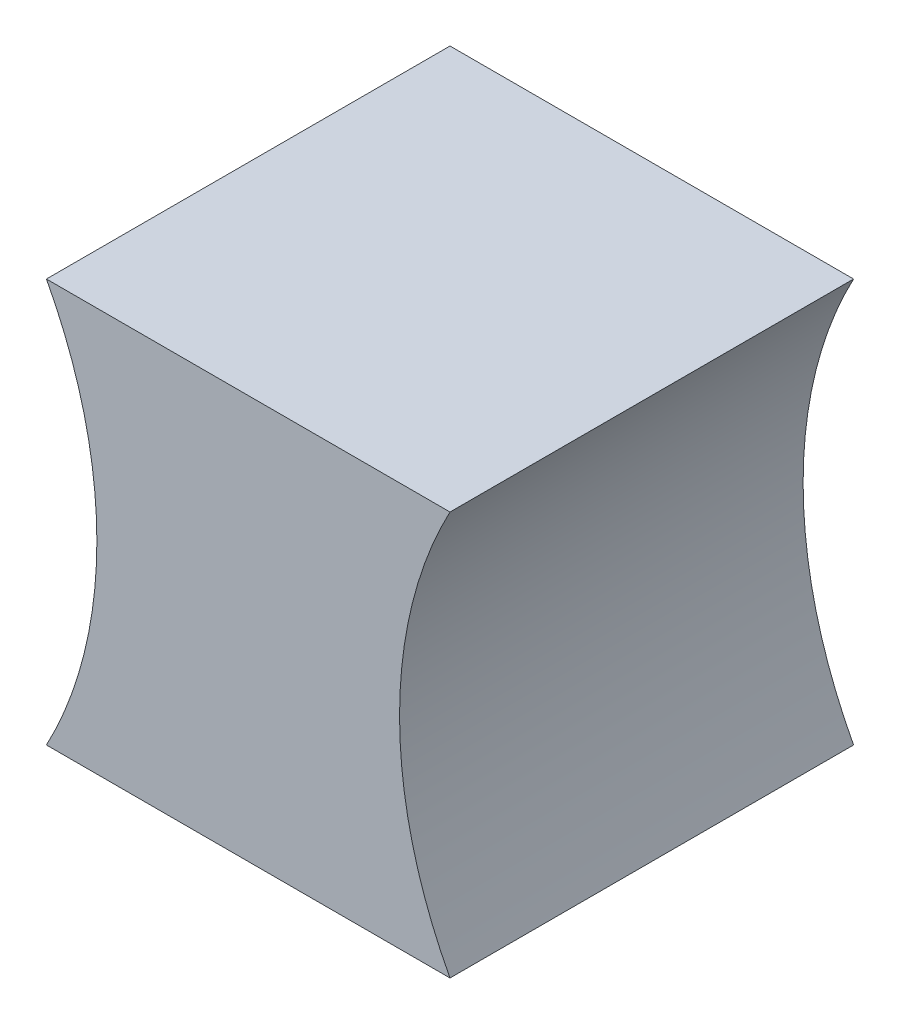
ISO-10303-21;
HEADER;
FILE_DESCRIPTION(('STEP AP214'),'2;1');
FILE_NAME('part.step','',(''),(''),'','','');
FILE_SCHEMA(('AUTOMOTIVE_DESIGN { 1 0 10303 214 1 1 1 1 }'));
ENDSEC;
DATA;
#1=APPLICATION_CONTEXT('core data for automotive mechanical design processes');
#2=APPLICATION_PROTOCOL_DEFINITION('international standard','automotive_design',2000,#1);
#3=PRODUCT_CONTEXT('',#1,'mechanical');
#4=PRODUCT('Part','Part','',(#3));
#5=PRODUCT_RELATED_PRODUCT_CATEGORY('part','',(#4));
#6=PRODUCT_DEFINITION_FORMATION('','',#4);
#7=PRODUCT_DEFINITION_CONTEXT('part definition',#1,'design');
#8=PRODUCT_DEFINITION('design','',#6,#7);
#9=PRODUCT_DEFINITION_SHAPE('','',#8);
#10=(LENGTH_UNIT() NAMED_UNIT(*) SI_UNIT(.MILLI.,.METRE.));
#11=(NAMED_UNIT(*) PLANE_ANGLE_UNIT() SI_UNIT($,.RADIAN.));
#12=(NAMED_UNIT(*) SI_UNIT($,.STERADIAN.) SOLID_ANGLE_UNIT());
#13=UNCERTAINTY_MEASURE_WITH_UNIT(LENGTH_MEASURE(1.E-05),#10,'distance_accuracy_value','');
#14=(GEOMETRIC_REPRESENTATION_CONTEXT(3) GLOBAL_UNCERTAINTY_ASSIGNED_CONTEXT((#13)) GLOBAL_UNIT_ASSIGNED_CONTEXT((#10,
#11,#12)) REPRESENTATION_CONTEXT('',''));
#15=CARTESIAN_POINT('',(0.,0.,0.));
#16=DIRECTION('',(0.,0.,1.));
#17=DIRECTION('',(1.,0.,0.));
#18=AXIS2_PLACEMENT_3D('',#15,#16,#17);
#19=CARTESIAN_POINT('',(-937.5,500.,1000.));
#20=DIRECTION('',(0.,0.,-1.));
#21=DIRECTION('',(-1.,0.,0.));
#22=AXIS2_PLACEMENT_3D('',#19,#20,#21);
#23=CYLINDRICAL_SURFACE('',#22,1062.5);
#24=CARTESIAN_POINT('',(-937.5,500.,0.));
#25=DIRECTION('',(0.,0.,-1.));
#26=DIRECTION('',(1.,0.,0.));
#27=AXIS2_PLACEMENT_3D('',#24,#25,#26);
#28=CIRCLE('',#27,1062.5);
#29=CARTESIAN_POINT('',(0.,1000.,0.));
#30=VERTEX_POINT('',#29);
#31=CARTESIAN_POINT('',(0.,0.,0.));
#32=VERTEX_POINT('',#31);
#33=EDGE_CURVE('E96',#30,#32,#28,.T.);
#34=ORIENTED_EDGE('',*,*,#33,.T.);
#35=DIRECTION('',(0.,0.,-1.));
#36=VECTOR('',#35,1.);
#37=CARTESIAN_POINT('',(0.,0.,1000.));
#38=LINE('',#37,#36);
#39=CARTESIAN_POINT('',(0.,0.,1000.));
#40=VERTEX_POINT('',#39);
#41=EDGE_CURVE('E11',#40,#32,#38,.T.);
#42=ORIENTED_EDGE('',*,*,#41,.F.);
#43=CARTESIAN_POINT('',(-937.5,500.,1000.));
#44=DIRECTION('',(0.,0.,-1.));
#45=DIRECTION('',(1.,0.,0.));
#46=AXIS2_PLACEMENT_3D('',#43,#44,#45);
#47=CIRCLE('',#46,1062.5);
#48=CARTESIAN_POINT('',(0.,1000.,1000.));
#49=VERTEX_POINT('',#48);
#50=EDGE_CURVE('E84',#49,#40,#47,.T.);
#51=ORIENTED_EDGE('',*,*,#50,.F.);
#52=DIRECTION('',(0.,0.,-1.));
#53=VECTOR('',#52,1.);
#54=CARTESIAN_POINT('',(0.,1000.,1000.));
#55=LINE('',#54,#53);
#56=EDGE_CURVE('E92',#49,#30,#55,.T.);
#57=ORIENTED_EDGE('',*,*,#56,.T.);
#58=EDGE_LOOP('',(#34,#42,#51,#57));
#59=FACE_BOUND('',#58,.T.);
#60=ADVANCED_FACE('F33',(#59),#23,.F.);
#61=CARTESIAN_POINT('',(0.,0.,1000.));
#62=DIRECTION('',(0.,1.,0.));
#63=DIRECTION('',(0.,0.,1.));
#64=AXIS2_PLACEMENT_3D('',#61,#62,#63);
#65=PLANE('',#64);
#66=DIRECTION('',(1.,0.,0.));
#67=VECTOR('',#66,1.);
#68=CARTESIAN_POINT('',(0.,0.,0.));
#69=LINE('',#68,#67);
#70=CARTESIAN_POINT('',(1000.,0.,0.));
#71=VERTEX_POINT('',#70);
#72=EDGE_CURVE('E88',#32,#71,#69,.T.);
#73=ORIENTED_EDGE('',*,*,#72,.T.);
#74=DIRECTION('',(0.,0.,-1.));
#75=VECTOR('',#74,1.);
#76=CARTESIAN_POINT('',(1000.,0.,1000.));
#77=LINE('',#76,#75);
#78=CARTESIAN_POINT('',(1000.,0.,1000.));
#79=VERTEX_POINT('',#78);
#80=EDGE_CURVE('E41',#79,#71,#77,.T.);
#81=ORIENTED_EDGE('',*,*,#80,.F.);
#82=DIRECTION('',(1.,0.,0.));
#83=VECTOR('',#82,1.);
#84=CARTESIAN_POINT('',(0.,0.,1000.));
#85=LINE('',#84,#83);
#86=EDGE_CURVE('E79',#40,#79,#85,.T.);
#87=ORIENTED_EDGE('',*,*,#86,.F.);
#88=ORIENTED_EDGE('',*,*,#41,.T.);
#89=EDGE_LOOP('',(#73,#81,#87,#88));
#90=FACE_BOUND('',#89,.T.);
#91=ADVANCED_FACE('F87',(#90),#65,.F.);
#92=CARTESIAN_POINT('',(1937.5,500.,1000.));
#93=DIRECTION('',(0.,0.,-1.));
#94=DIRECTION('',(-1.,0.,0.));
#95=AXIS2_PLACEMENT_3D('',#92,#93,#94);
#96=CYLINDRICAL_SURFACE('',#95,1062.5);
#97=CARTESIAN_POINT('',(1937.5,500.,0.));
#98=DIRECTION('',(0.,0.,-1.));
#99=DIRECTION('',(-1.,0.,0.));
#100=AXIS2_PLACEMENT_3D('',#97,#98,#99);
#101=CIRCLE('',#100,1062.5);
#102=CARTESIAN_POINT('',(1000.,1000.,0.));
#103=VERTEX_POINT('',#102);
#104=EDGE_CURVE('E66',#71,#103,#101,.T.);
#105=ORIENTED_EDGE('',*,*,#104,.T.);
#106=DIRECTION('',(0.,0.,-1.));
#107=VECTOR('',#106,1.);
#108=CARTESIAN_POINT('',(1000.,1000.,1000.));
#109=LINE('',#108,#107);
#110=CARTESIAN_POINT('',(1000.,1000.,1000.));
#111=VERTEX_POINT('',#110);
#112=EDGE_CURVE('E89',#111,#103,#109,.T.);
#113=ORIENTED_EDGE('',*,*,#112,.F.);
#114=CARTESIAN_POINT('',(1937.5,500.,1000.));
#115=DIRECTION('',(0.,0.,-1.));
#116=DIRECTION('',(-1.,0.,0.));
#117=AXIS2_PLACEMENT_3D('',#114,#115,#116);
#118=CIRCLE('',#117,1062.5);
#119=EDGE_CURVE('E82',#79,#111,#118,.T.);
#120=ORIENTED_EDGE('',*,*,#119,.F.);
#121=ORIENTED_EDGE('',*,*,#80,.T.);
#122=EDGE_LOOP('',(#105,#113,#120,#121));
#123=FACE_BOUND('',#122,.T.);
#124=ADVANCED_FACE('F90',(#123),#96,.F.);
#125=CARTESIAN_POINT('',(0.,1000.,1000.));
#126=DIRECTION('',(0.,-1.,0.));
#127=DIRECTION('',(0.,0.,-1.));
#128=AXIS2_PLACEMENT_3D('',#125,#126,#127);
#129=PLANE('',#128);
#130=DIRECTION('',(-1.,0.,0.));
#131=VECTOR('',#130,1.);
#132=CARTESIAN_POINT('',(0.,1000.,0.));
#133=LINE('',#132,#131);
#134=EDGE_CURVE('E72',#103,#30,#133,.T.);
#135=ORIENTED_EDGE('',*,*,#134,.T.);
#136=ORIENTED_EDGE('',*,*,#56,.F.);
#137=DIRECTION('',(-1.,0.,0.));
#138=VECTOR('',#137,1.);
#139=CARTESIAN_POINT('',(0.,1000.,1000.));
#140=LINE('',#139,#138);
#141=EDGE_CURVE('E49',#111,#49,#140,.T.);
#142=ORIENTED_EDGE('',*,*,#141,.F.);
#143=ORIENTED_EDGE('',*,*,#112,.T.);
#144=EDGE_LOOP('',(#135,#136,#142,#143));
#145=FACE_BOUND('',#144,.T.);
#146=ADVANCED_FACE('F103',(#145),#129,.F.);
#147=CARTESIAN_POINT('',(-937.5,500.,1000.));
#148=DIRECTION('',(0.,0.,1.));
#149=DIRECTION('',(1.,0.,0.));
#150=AXIS2_PLACEMENT_3D('',#147,#148,#149);
#151=PLANE('',#150);
#152=ORIENTED_EDGE('',*,*,#50,.T.);
#153=ORIENTED_EDGE('',*,*,#86,.T.);
#154=ORIENTED_EDGE('',*,*,#119,.T.);
#155=ORIENTED_EDGE('',*,*,#141,.T.);
#156=EDGE_LOOP('',(#152,#153,#154,#155));
#157=FACE_BOUND('',#156,.T.);
#158=ADVANCED_FACE('F80',(#157),#151,.T.);
#159=CARTESIAN_POINT('',(-937.5,500.,0.));
#160=DIRECTION('',(0.,0.,1.));
#161=DIRECTION('',(1.,0.,0.));
#162=AXIS2_PLACEMENT_3D('',#159,#160,#161);
#163=PLANE('',#162);
#164=ORIENTED_EDGE('',*,*,#33,.F.);
#165=ORIENTED_EDGE('',*,*,#134,.F.);
#166=ORIENTED_EDGE('',*,*,#104,.F.);
#167=ORIENTED_EDGE('',*,*,#72,.F.);
#168=EDGE_LOOP('',(#164,#165,#166,#167));
#169=FACE_BOUND('',#168,.T.);
#170=ADVANCED_FACE('F106',(#169),#163,.F.);
#171=CLOSED_SHELL('',(#60,#91,#124,#146,#158,#170));
#172=MANIFOLD_SOLID_BREP('B2',#171);
#173=ADVANCED_BREP_SHAPE_REPRESENTATION('',(#18,#172),#14);
#174=SHAPE_DEFINITION_REPRESENTATION(#9,#173);
ENDSEC;
END-ISO-10303-21;
